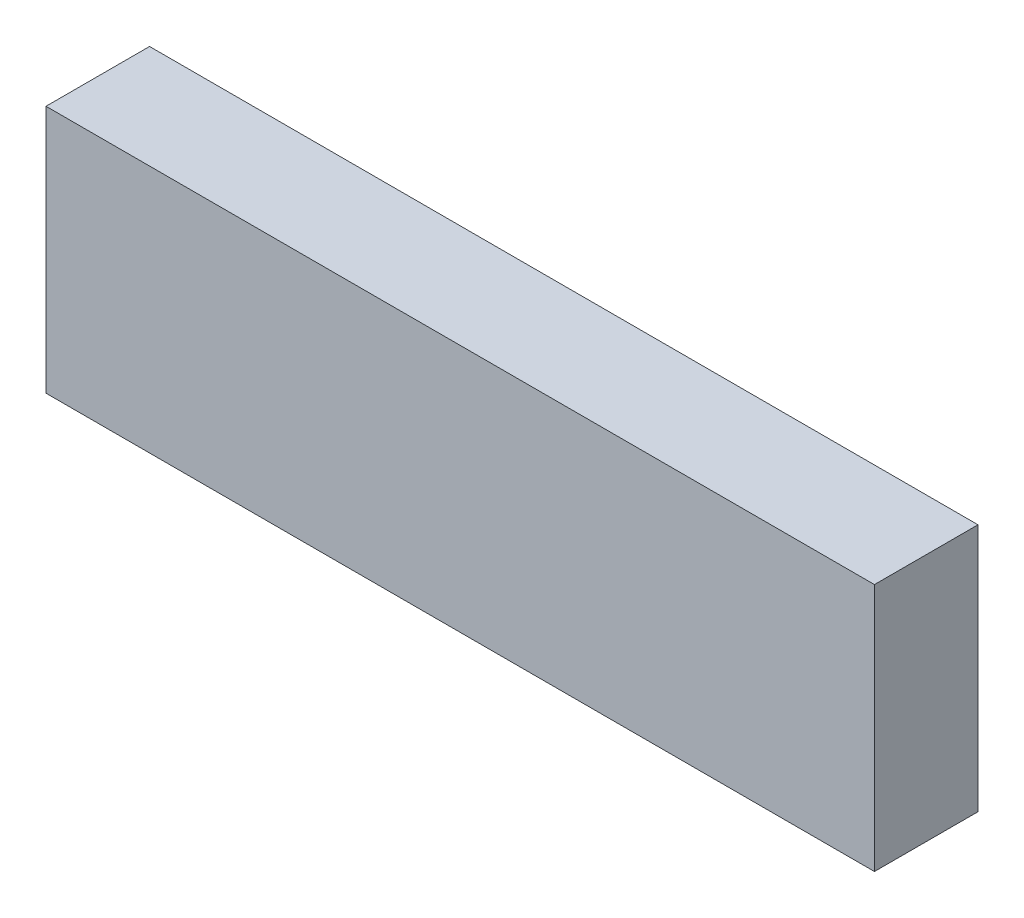
ISO-10303-21;
HEADER;
FILE_DESCRIPTION(('STEP AP214'),'2;1');
FILE_NAME('part.step','',(''),(''),'','','');
FILE_SCHEMA(('AUTOMOTIVE_DESIGN { 1 0 10303 214 1 1 1 1 }'));
ENDSEC;
DATA;
#1=APPLICATION_CONTEXT('core data for automotive mechanical design processes');
#2=APPLICATION_PROTOCOL_DEFINITION('international standard','automotive_design',2000,#1);
#3=PRODUCT_CONTEXT('',#1,'mechanical');
#4=PRODUCT('Part','Part','',(#3));
#5=PRODUCT_RELATED_PRODUCT_CATEGORY('part','',(#4));
#6=PRODUCT_DEFINITION_FORMATION('','',#4);
#7=PRODUCT_DEFINITION_CONTEXT('part definition',#1,'design');
#8=PRODUCT_DEFINITION('design','',#6,#7);
#9=PRODUCT_DEFINITION_SHAPE('','',#8);
#10=(LENGTH_UNIT() NAMED_UNIT(*) SI_UNIT(.MILLI.,.METRE.));
#11=(NAMED_UNIT(*) PLANE_ANGLE_UNIT() SI_UNIT($,.RADIAN.));
#12=(NAMED_UNIT(*) SI_UNIT($,.STERADIAN.) SOLID_ANGLE_UNIT());
#13=UNCERTAINTY_MEASURE_WITH_UNIT(LENGTH_MEASURE(1.E-05),#10,'distance_accuracy_value','');
#14=(GEOMETRIC_REPRESENTATION_CONTEXT(3) GLOBAL_UNCERTAINTY_ASSIGNED_CONTEXT((#13)) GLOBAL_UNIT_ASSIGNED_CONTEXT((#10,
#11,#12)) REPRESENTATION_CONTEXT('',''));
#15=CARTESIAN_POINT('',(0.,0.,0.));
#16=DIRECTION('',(0.,0.,1.));
#17=DIRECTION('',(1.,0.,0.));
#18=AXIS2_PLACEMENT_3D('',#15,#16,#17);
#19=CARTESIAN_POINT('',(0.,0.,5.));
#20=DIRECTION('',(1.,0.,0.));
#21=DIRECTION('',(0.,0.,-1.));
#22=AXIS2_PLACEMENT_3D('',#19,#20,#21);
#23=PLANE('',#22);
#24=DIRECTION('',(0.,-1.,0.));
#25=VECTOR('',#24,1.);
#26=CARTESIAN_POINT('',(0.,0.,0.));
#27=LINE('',#26,#25);
#28=CARTESIAN_POINT('',(0.,12.,0.));
#29=VERTEX_POINT('',#28);
#30=CARTESIAN_POINT('',(0.,0.,0.));
#31=VERTEX_POINT('',#30);
#32=EDGE_CURVE('E107',#29,#31,#27,.T.);
#33=ORIENTED_EDGE('',*,*,#32,.T.);
#34=DIRECTION('',(0.,0.,-1.));
#35=VECTOR('',#34,1.);
#36=CARTESIAN_POINT('',(0.,0.,5.));
#37=LINE('',#36,#35);
#38=CARTESIAN_POINT('',(0.,0.,5.));
#39=VERTEX_POINT('',#38);
#40=EDGE_CURVE('E11',#39,#31,#37,.T.);
#41=ORIENTED_EDGE('',*,*,#40,.F.);
#42=DIRECTION('',(0.,-1.,0.));
#43=VECTOR('',#42,1.);
#44=CARTESIAN_POINT('',(0.,0.,5.));
#45=LINE('',#44,#43);
#46=CARTESIAN_POINT('',(0.,12.,5.));
#47=VERTEX_POINT('',#46);
#48=EDGE_CURVE('E91',#47,#39,#45,.T.);
#49=ORIENTED_EDGE('',*,*,#48,.F.);
#50=DIRECTION('',(0.,0.,-1.));
#51=VECTOR('',#50,1.);
#52=CARTESIAN_POINT('',(0.,12.,5.));
#53=LINE('',#52,#51);
#54=EDGE_CURVE('E103',#47,#29,#53,.T.);
#55=ORIENTED_EDGE('',*,*,#54,.T.);
#56=EDGE_LOOP('',(#33,#41,#49,#55));
#57=FACE_BOUND('',#56,.T.);
#58=ADVANCED_FACE('F39',(#57),#23,.F.);
#59=CARTESIAN_POINT('',(0.,0.,5.));
#60=DIRECTION('',(0.,1.,0.));
#61=DIRECTION('',(0.,0.,1.));
#62=AXIS2_PLACEMENT_3D('',#59,#60,#61);
#63=PLANE('',#62);
#64=DIRECTION('',(1.,0.,0.));
#65=VECTOR('',#64,1.);
#66=CARTESIAN_POINT('',(0.,0.,0.));
#67=LINE('',#66,#65);
#68=CARTESIAN_POINT('',(40.,0.,0.));
#69=VERTEX_POINT('',#68);
#70=EDGE_CURVE('E96',#31,#69,#67,.T.);
#71=ORIENTED_EDGE('',*,*,#70,.T.);
#72=DIRECTION('',(0.,0.,-1.));
#73=VECTOR('',#72,1.);
#74=CARTESIAN_POINT('',(40.,0.,5.));
#75=LINE('',#74,#73);
#76=CARTESIAN_POINT('',(40.,0.,5.));
#77=VERTEX_POINT('',#76);
#78=EDGE_CURVE('E48',#77,#69,#75,.T.);
#79=ORIENTED_EDGE('',*,*,#78,.F.);
#80=DIRECTION('',(1.,0.,0.));
#81=VECTOR('',#80,1.);
#82=CARTESIAN_POINT('',(0.,0.,5.));
#83=LINE('',#82,#81);
#84=EDGE_CURVE('E86',#39,#77,#83,.T.);
#85=ORIENTED_EDGE('',*,*,#84,.F.);
#86=ORIENTED_EDGE('',*,*,#40,.T.);
#87=EDGE_LOOP('',(#71,#79,#85,#86));
#88=FACE_BOUND('',#87,.T.);
#89=ADVANCED_FACE('F95',(#88),#63,.F.);
#90=CARTESIAN_POINT('',(40.,0.,5.));
#91=DIRECTION('',(-1.,0.,0.));
#92=DIRECTION('',(0.,0.,1.));
#93=AXIS2_PLACEMENT_3D('',#90,#91,#92);
#94=PLANE('',#93);
#95=DIRECTION('',(0.,1.,0.));
#96=VECTOR('',#95,1.);
#97=CARTESIAN_POINT('',(40.,0.,0.));
#98=LINE('',#97,#96);
#99=CARTESIAN_POINT('',(40.,12.,0.));
#100=VERTEX_POINT('',#99);
#101=EDGE_CURVE('E73',#69,#100,#98,.T.);
#102=ORIENTED_EDGE('',*,*,#101,.T.);
#103=DIRECTION('',(0.,0.,-1.));
#104=VECTOR('',#103,1.);
#105=CARTESIAN_POINT('',(40.,12.,5.));
#106=LINE('',#105,#104);
#107=CARTESIAN_POINT('',(40.,12.,5.));
#108=VERTEX_POINT('',#107);
#109=EDGE_CURVE('E98',#108,#100,#106,.T.);
#110=ORIENTED_EDGE('',*,*,#109,.F.);
#111=DIRECTION('',(0.,1.,0.));
#112=VECTOR('',#111,1.);
#113=CARTESIAN_POINT('',(40.,0.,5.));
#114=LINE('',#113,#112);
#115=EDGE_CURVE('E89',#77,#108,#114,.T.);
#116=ORIENTED_EDGE('',*,*,#115,.F.);
#117=ORIENTED_EDGE('',*,*,#78,.T.);
#118=EDGE_LOOP('',(#102,#110,#116,#117));
#119=FACE_BOUND('',#118,.T.);
#120=ADVANCED_FACE('F99',(#119),#94,.F.);
#121=CARTESIAN_POINT('',(0.,12.,5.));
#122=DIRECTION('',(0.,-1.,0.));
#123=DIRECTION('',(0.,0.,-1.));
#124=AXIS2_PLACEMENT_3D('',#121,#122,#123);
#125=PLANE('',#124);
#126=DIRECTION('',(-1.,0.,0.));
#127=VECTOR('',#126,1.);
#128=CARTESIAN_POINT('',(0.,12.,0.));
#129=LINE('',#128,#127);
#130=EDGE_CURVE('E79',#100,#29,#129,.T.);
#131=ORIENTED_EDGE('',*,*,#130,.T.);
#132=ORIENTED_EDGE('',*,*,#54,.F.);
#133=DIRECTION('',(-1.,0.,0.));
#134=VECTOR('',#133,1.);
#135=CARTESIAN_POINT('',(0.,12.,5.));
#136=LINE('',#135,#134);
#137=EDGE_CURVE('E56',#108,#47,#136,.T.);
#138=ORIENTED_EDGE('',*,*,#137,.F.);
#139=ORIENTED_EDGE('',*,*,#109,.T.);
#140=EDGE_LOOP('',(#131,#132,#138,#139));
#141=FACE_BOUND('',#140,.T.);
#142=ADVANCED_FACE('F120',(#141),#125,.F.);
#143=CARTESIAN_POINT('',(0.,0.,5.));
#144=DIRECTION('',(0.,0.,-1.));
#145=DIRECTION('',(-1.,0.,0.));
#146=AXIS2_PLACEMENT_3D('',#143,#144,#145);
#147=PLANE('',#146);
#148=ORIENTED_EDGE('',*,*,#48,.T.);
#149=ORIENTED_EDGE('',*,*,#84,.T.);
#150=ORIENTED_EDGE('',*,*,#115,.T.);
#151=ORIENTED_EDGE('',*,*,#137,.T.);
#152=EDGE_LOOP('',(#148,#149,#150,#151));
#153=FACE_BOUND('',#152,.T.);
#154=ADVANCED_FACE('F87',(#153),#147,.F.);
#155=CARTESIAN_POINT('',(0.,0.,0.));
#156=DIRECTION('',(0.,0.,-1.));
#157=DIRECTION('',(-1.,0.,0.));
#158=AXIS2_PLACEMENT_3D('',#155,#156,#157);
#159=PLANE('',#158);
#160=ORIENTED_EDGE('',*,*,#32,.F.);
#161=ORIENTED_EDGE('',*,*,#130,.F.);
#162=ORIENTED_EDGE('',*,*,#101,.F.);
#163=ORIENTED_EDGE('',*,*,#70,.F.);
#164=EDGE_LOOP('',(#160,#161,#162,#163));
#165=FACE_BOUND('',#164,.T.);
#166=ADVANCED_FACE('F123',(#165),#159,.T.);
#167=CLOSED_SHELL('',(#58,#89,#120,#142,#154,#166));
#168=MANIFOLD_SOLID_BREP('B2',#167);
#169=ADVANCED_BREP_SHAPE_REPRESENTATION('',(#18,#168),#14);
#170=SHAPE_DEFINITION_REPRESENTATION(#9,#169);
ENDSEC;
END-ISO-10303-21;
